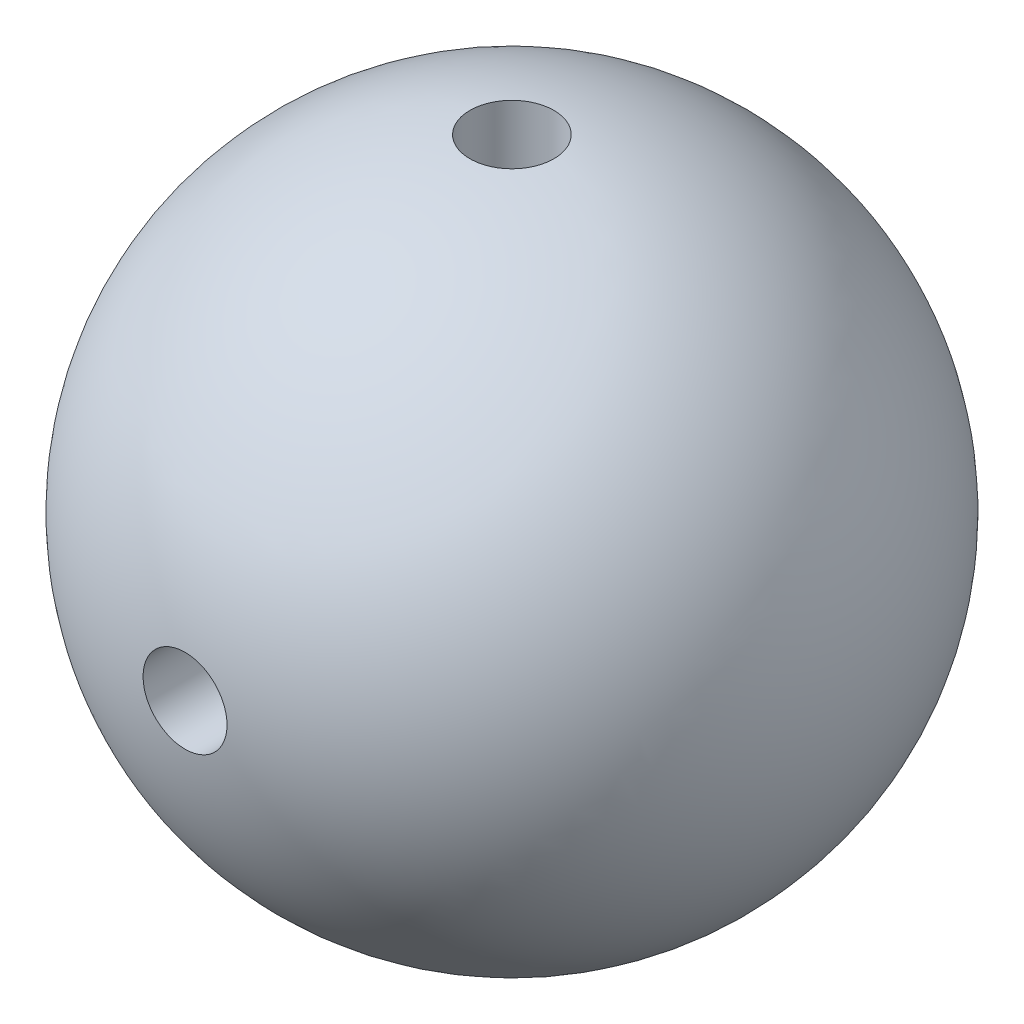
ISO-10303-21;
HEADER;
FILE_DESCRIPTION(('STEP AP214'),'2;1');
FILE_NAME('part.step','',(''),(''),'','','');
FILE_SCHEMA(('AUTOMOTIVE_DESIGN { 1 0 10303 214 1 1 1 1 }'));
ENDSEC;
DATA;
#1=APPLICATION_CONTEXT('core data for automotive mechanical design processes');
#2=APPLICATION_PROTOCOL_DEFINITION('international standard','automotive_design',2000,#1);
#3=PRODUCT_CONTEXT('',#1,'mechanical');
#4=PRODUCT('Part','Part','',(#3));
#5=PRODUCT_RELATED_PRODUCT_CATEGORY('part','',(#4));
#6=PRODUCT_DEFINITION_FORMATION('','',#4);
#7=PRODUCT_DEFINITION_CONTEXT('part definition',#1,'design');
#8=PRODUCT_DEFINITION('design','',#6,#7);
#9=PRODUCT_DEFINITION_SHAPE('','',#8);
#10=(LENGTH_UNIT() NAMED_UNIT(*) SI_UNIT(.MILLI.,.METRE.));
#11=(NAMED_UNIT(*) PLANE_ANGLE_UNIT() SI_UNIT($,.RADIAN.));
#12=(NAMED_UNIT(*) SI_UNIT($,.STERADIAN.) SOLID_ANGLE_UNIT());
#13=UNCERTAINTY_MEASURE_WITH_UNIT(LENGTH_MEASURE(1.E-05),#10,'distance_accuracy_value','');
#14=(GEOMETRIC_REPRESENTATION_CONTEXT(3) GLOBAL_UNCERTAINTY_ASSIGNED_CONTEXT((#13)) GLOBAL_UNIT_ASSIGNED_CONTEXT((#10,
#11,#12)) REPRESENTATION_CONTEXT('',''));
#15=CARTESIAN_POINT('',(0.,0.,0.));
#16=DIRECTION('',(0.,0.,1.));
#17=DIRECTION('',(1.,0.,0.));
#18=AXIS2_PLACEMENT_3D('',#15,#16,#17);
#19=CARTESIAN_POINT('',(0.,-7.851,0.));
#20=DIRECTION('',(0.,1.,0.));
#21=DIRECTION('',(0.,0.,1.));
#22=AXIS2_PLACEMENT_3D('',#19,#20,#21);
#23=CYLINDRICAL_SURFACE('',#22,1.);
#24=CARTESIAN_POINT('',(0.,7.78604520921886,0.));
#25=DIRECTION('',(0.,-1.,0.));
#26=DIRECTION('',(0.,0.,-1.));
#27=AXIS2_PLACEMENT_3D('',#24,#25,#26);
#28=CIRCLE('',#27,1.);
#29=CARTESIAN_POINT('',(0.,7.78604520921886,-1.));
#30=VERTEX_POINT('',#29);
#31=EDGE_CURVE('E85',#30,#30,#28,.T.);
#32=ORIENTED_EDGE('',*,*,#31,.F.);
#33=EDGE_LOOP('',(#32));
#34=FACE_BOUND('',#33,.T.);
#35=CARTESIAN_POINT('',(0.,0.,0.));
#36=DIRECTION('',(0.,0.707106781186547,-0.707106781186547));
#37=DIRECTION('',(0.,0.707106781186547,0.707106781186547));
#38=AXIS2_PLACEMENT_3D('',#35,#36,#37);
#39=ELLIPSE('',#38,1.41421356237309,1.);
#40=CARTESIAN_POINT('',(1.,0.,0.));
#41=VERTEX_POINT('',#40);
#42=CARTESIAN_POINT('',(-1.,0.,0.));
#43=VERTEX_POINT('',#42);
#44=EDGE_CURVE('E61',#41,#43,#39,.F.);
#45=ORIENTED_EDGE('',*,*,#44,.T.);
#46=CARTESIAN_POINT('',(0.,0.,0.));
#47=DIRECTION('',(0.,0.707106781186547,0.707106781186547));
#48=DIRECTION('',(0.,0.707106781186547,-0.707106781186547));
#49=AXIS2_PLACEMENT_3D('',#46,#47,#48);
#50=ELLIPSE('',#49,1.41421356237309,1.);
#51=EDGE_CURVE('E11',#43,#41,#50,.F.);
#52=ORIENTED_EDGE('',*,*,#51,.T.);
#53=EDGE_LOOP('',(#45,#52));
#54=FACE_BOUND('',#53,.T.);
#55=ADVANCED_FACE('F47',(#34,#54),#23,.F.);
#56=CARTESIAN_POINT('',(0.,0.,0.));
#57=DIRECTION('',(0.,0.,-1.));
#58=DIRECTION('',(1.,0.,0.));
#59=AXIS2_PLACEMENT_3D('',#56,#57,#58);
#60=SPHERICAL_SURFACE('',#59,7.85);
#61=CARTESIAN_POINT('',(0.,0.,7.78604520921886));
#62=DIRECTION('',(0.,0.,-1.));
#63=DIRECTION('',(-1.,0.,0.));
#64=AXIS2_PLACEMENT_3D('',#61,#62,#63);
#65=CIRCLE('',#64,1.);
#66=CARTESIAN_POINT('',(-1.,0.,7.78604520921886));
#67=VERTEX_POINT('',#66);
#68=EDGE_CURVE('E93',#67,#67,#65,.T.);
#69=ORIENTED_EDGE('',*,*,#68,.T.);
#70=EDGE_LOOP('',(#69));
#71=FACE_BOUND('',#70,.T.);
#72=CARTESIAN_POINT('',(0.,0.,-7.78604520921886));
#73=DIRECTION('',(0.,0.,1.));
#74=DIRECTION('',(1.,0.,0.));
#75=AXIS2_PLACEMENT_3D('',#72,#73,#74);
#76=CIRCLE('',#75,1.);
#77=CARTESIAN_POINT('',(1.,0.,-7.78604520921886));
#78=VERTEX_POINT('',#77);
#79=EDGE_CURVE('E89',#78,#78,#76,.F.);
#80=ORIENTED_EDGE('',*,*,#79,.F.);
#81=EDGE_LOOP('',(#80));
#82=FACE_BOUND('',#81,.T.);
#83=ORIENTED_EDGE('',*,*,#31,.T.);
#84=EDGE_LOOP('',(#83));
#85=FACE_BOUND('',#84,.T.);
#86=CARTESIAN_POINT('',(0.,-7.78604520921886,0.));
#87=DIRECTION('',(0.,1.,0.));
#88=DIRECTION('',(0.,0.,1.));
#89=AXIS2_PLACEMENT_3D('',#86,#87,#88);
#90=CIRCLE('',#89,1.);
#91=CARTESIAN_POINT('',(0.,-7.78604520921886,1.));
#92=VERTEX_POINT('',#91);
#93=EDGE_CURVE('E76',#92,#92,#90,.F.);
#94=ORIENTED_EDGE('',*,*,#93,.F.);
#95=EDGE_LOOP('',(#94));
#96=FACE_BOUND('',#95,.T.);
#97=ADVANCED_FACE('F49',(#71,#82,#85,#96),#60,.T.);
#98=CARTESIAN_POINT('',(0.,0.,0.));
#99=DIRECTION('',(0.,0.707106781186547,-0.707106781186547));
#100=DIRECTION('',(0.,0.707106781186547,0.707106781186547));
#101=AXIS2_PLACEMENT_3D('',#98,#99,#100);
#102=ELLIPSE('',#101,1.41421356237309,1.);
#103=EDGE_CURVE('E67',#41,#43,#102,.T.);
#104=ORIENTED_EDGE('',*,*,#103,.T.);
#105=CARTESIAN_POINT('',(0.,0.,0.));
#106=DIRECTION('',(0.,0.707106781186547,0.707106781186547));
#107=DIRECTION('',(0.,0.707106781186547,-0.707106781186547));
#108=AXIS2_PLACEMENT_3D('',#105,#106,#107);
#109=ELLIPSE('',#108,1.41421356237309,1.);
#110=EDGE_CURVE('E56',#43,#41,#109,.T.);
#111=ORIENTED_EDGE('',*,*,#110,.T.);
#112=EDGE_LOOP('',(#104,#111));
#113=FACE_BOUND('',#112,.T.);
#114=ORIENTED_EDGE('',*,*,#93,.T.);
#115=EDGE_LOOP('',(#114));
#116=FACE_BOUND('',#115,.T.);
#117=ADVANCED_FACE('F78',(#113,#116),#23,.F.);
#118=CARTESIAN_POINT('',(0.,0.,-7.851));
#119=DIRECTION('',(0.,0.,1.));
#120=DIRECTION('',(1.,0.,0.));
#121=AXIS2_PLACEMENT_3D('',#118,#119,#120);
#122=CYLINDRICAL_SURFACE('',#121,1.);
#123=ORIENTED_EDGE('',*,*,#68,.F.);
#124=EDGE_LOOP('',(#123));
#125=FACE_BOUND('',#124,.T.);
#126=ORIENTED_EDGE('',*,*,#44,.F.);
#127=ORIENTED_EDGE('',*,*,#110,.F.);
#128=EDGE_LOOP('',(#126,#127));
#129=FACE_BOUND('',#128,.T.);
#130=ADVANCED_FACE('F74',(#125,#129),#122,.F.);
#131=ORIENTED_EDGE('',*,*,#79,.T.);
#132=EDGE_LOOP('',(#131));
#133=FACE_BOUND('',#132,.T.);
#134=ORIENTED_EDGE('',*,*,#103,.F.);
#135=ORIENTED_EDGE('',*,*,#51,.F.);
#136=EDGE_LOOP('',(#134,#135));
#137=FACE_BOUND('',#136,.T.);
#138=ADVANCED_FACE('F68',(#133,#137),#122,.F.);
#139=CLOSED_SHELL('',(#55,#97,#117,#130,#138));
#140=MANIFOLD_SOLID_BREP('B2',#139);
#141=ADVANCED_BREP_SHAPE_REPRESENTATION('',(#18,#140),#14);
#142=SHAPE_DEFINITION_REPRESENTATION(#9,#141);
ENDSEC;
END-ISO-10303-21;
